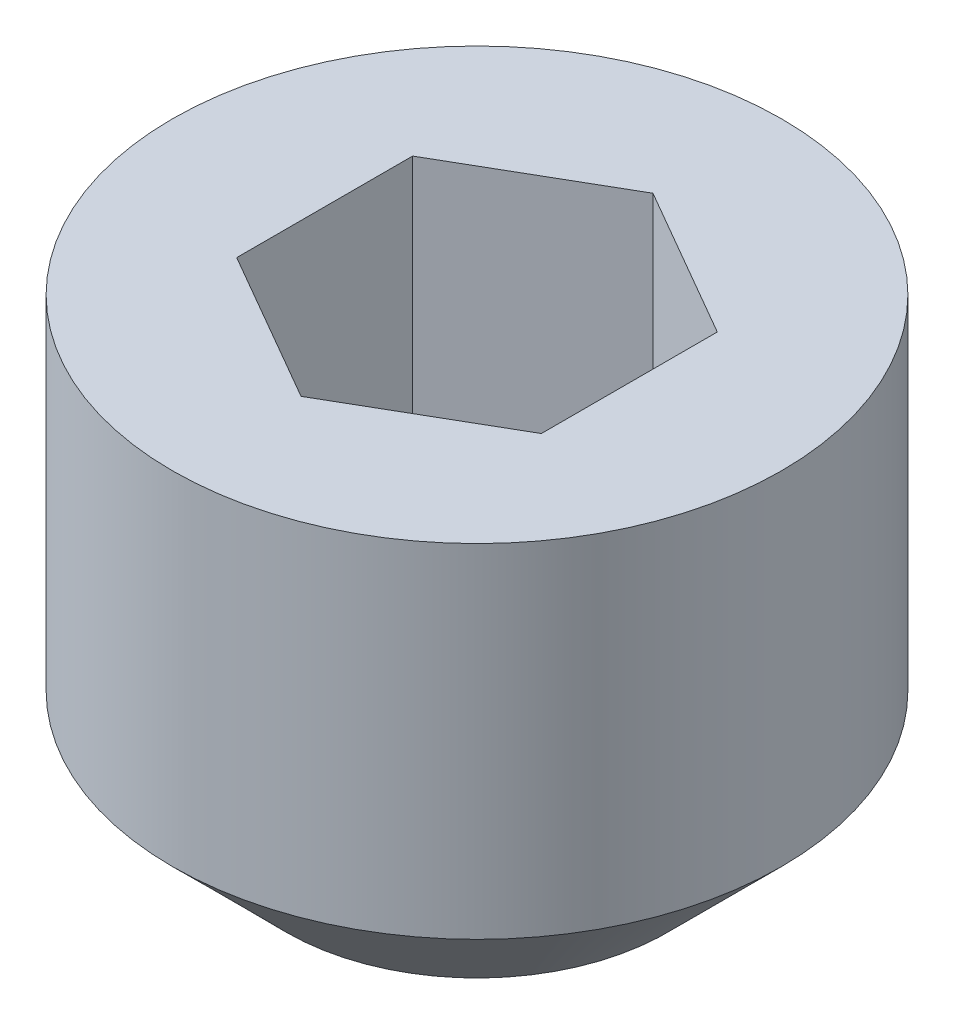
ISO-10303-21;
HEADER;
FILE_DESCRIPTION(('STEP AP214'),'2;1');
FILE_NAME('part.step','',(''),(''),'','','');
FILE_SCHEMA(('AUTOMOTIVE_DESIGN { 1 0 10303 214 1 1 1 1 }'));
ENDSEC;
DATA;
#1=APPLICATION_CONTEXT('core data for automotive mechanical design processes');
#2=APPLICATION_PROTOCOL_DEFINITION('international standard','automotive_design',2000,#1);
#3=PRODUCT_CONTEXT('',#1,'mechanical');
#4=PRODUCT('Part','Part','',(#3));
#5=PRODUCT_RELATED_PRODUCT_CATEGORY('part','',(#4));
#6=PRODUCT_DEFINITION_FORMATION('','',#4);
#7=PRODUCT_DEFINITION_CONTEXT('part definition',#1,'design');
#8=PRODUCT_DEFINITION('design','',#6,#7);
#9=PRODUCT_DEFINITION_SHAPE('','',#8);
#10=(LENGTH_UNIT() NAMED_UNIT(*) SI_UNIT(.MILLI.,.METRE.));
#11=(NAMED_UNIT(*) PLANE_ANGLE_UNIT() SI_UNIT($,.RADIAN.));
#12=(NAMED_UNIT(*) SI_UNIT($,.STERADIAN.) SOLID_ANGLE_UNIT());
#13=UNCERTAINTY_MEASURE_WITH_UNIT(LENGTH_MEASURE(1.E-05),#10,'distance_accuracy_value','');
#14=(GEOMETRIC_REPRESENTATION_CONTEXT(3) GLOBAL_UNCERTAINTY_ASSIGNED_CONTEXT((#13)) GLOBAL_UNIT_ASSIGNED_CONTEXT((#10,
#11,#12)) REPRESENTATION_CONTEXT('',''));
#15=CARTESIAN_POINT('',(0.,0.,0.));
#16=DIRECTION('',(0.,0.,1.));
#17=DIRECTION('',(1.,0.,0.));
#18=AXIS2_PLACEMENT_3D('',#15,#16,#17);
#19=CARTESIAN_POINT('',(0.,3.,0.));
#20=DIRECTION('',(0.,-1.,0.));
#21=DIRECTION('',(1.,0.,0.));
#22=AXIS2_PLACEMENT_3D('',#19,#20,#21);
#23=PLANE('',#22);
#24=CARTESIAN_POINT('',(0.,3.,0.));
#25=DIRECTION('',(0.,1.,0.));
#26=DIRECTION('',(-1.,0.,0.));
#27=AXIS2_PLACEMENT_3D('',#24,#25,#26);
#28=CIRCLE('',#27,2.);
#29=CARTESIAN_POINT('',(-2.,3.,0.));
#30=VERTEX_POINT('',#29);
#31=EDGE_CURVE('E11',#30,#30,#28,.T.);
#32=ORIENTED_EDGE('',*,*,#31,.T.);
#33=EDGE_LOOP('',(#32));
#34=FACE_BOUND('',#33,.T.);
#35=DIRECTION('',(-0.866025403784438,0.,0.5));
#36=VECTOR('',#35,1.);
#37=CARTESIAN_POINT('',(0.,3.,-1.15470053837925));
#38=LINE('',#37,#36);
#39=CARTESIAN_POINT('',(0.,3.,-1.15470053837925));
#40=VERTEX_POINT('',#39);
#41=CARTESIAN_POINT('',(-0.999999999999999,3.,-0.577350269189626));
#42=VERTEX_POINT('',#41);
#43=EDGE_CURVE('E149',#40,#42,#38,.T.);
#44=ORIENTED_EDGE('',*,*,#43,.F.);
#45=DIRECTION('',(-0.866025403784439,0.,-0.499999999999999));
#46=VECTOR('',#45,1.);
#47=CARTESIAN_POINT('',(1.,3.,-0.577350269189626));
#48=LINE('',#47,#46);
#49=CARTESIAN_POINT('',(1.,3.,-0.577350269189626));
#50=VERTEX_POINT('',#49);
#51=EDGE_CURVE('E49',#50,#40,#48,.T.);
#52=ORIENTED_EDGE('',*,*,#51,.F.);
#53=DIRECTION('',(0.,0.,-1.));
#54=VECTOR('',#53,1.);
#55=CARTESIAN_POINT('',(1.,3.,0.577350269189626));
#56=LINE('',#55,#54);
#57=CARTESIAN_POINT('',(1.,3.,0.577350269189626));
#58=VERTEX_POINT('',#57);
#59=EDGE_CURVE('E119',#58,#50,#56,.T.);
#60=ORIENTED_EDGE('',*,*,#59,.F.);
#61=DIRECTION('',(0.866025403784439,0.,-0.5));
#62=VECTOR('',#61,1.);
#63=CARTESIAN_POINT('',(0.,3.,1.15470053837925));
#64=LINE('',#63,#62);
#65=CARTESIAN_POINT('',(0.,3.,1.15470053837925));
#66=VERTEX_POINT('',#65);
#67=EDGE_CURVE('E157',#66,#58,#64,.T.);
#68=ORIENTED_EDGE('',*,*,#67,.F.);
#69=DIRECTION('',(0.866025403784439,0.,0.499999999999999));
#70=VECTOR('',#69,1.);
#71=CARTESIAN_POINT('',(-0.999999999999999,3.,0.577350269189626));
#72=LINE('',#71,#70);
#73=CARTESIAN_POINT('',(-0.999999999999999,3.,0.577350269189626));
#74=VERTEX_POINT('',#73);
#75=EDGE_CURVE('E154',#74,#66,#72,.T.);
#76=ORIENTED_EDGE('',*,*,#75,.F.);
#77=DIRECTION('',(0.,0.,1.));
#78=VECTOR('',#77,1.);
#79=CARTESIAN_POINT('',(-0.999999999999999,3.,-0.577350269189626));
#80=LINE('',#79,#78);
#81=EDGE_CURVE('E152',#42,#74,#80,.T.);
#82=ORIENTED_EDGE('',*,*,#81,.F.);
#83=EDGE_LOOP('',(#44,#52,#60,#68,#76,#82));
#84=FACE_BOUND('',#83,.T.);
#85=ADVANCED_FACE('F35',(#34,#84),#23,.F.);
#86=CARTESIAN_POINT('',(0.,3.,0.));
#87=DIRECTION('',(0.,1.,0.));
#88=DIRECTION('',(-1.,0.,0.));
#89=AXIS2_PLACEMENT_3D('',#86,#87,#88);
#90=CYLINDRICAL_SURFACE('',#89,2.);
#91=CARTESIAN_POINT('',(0.,0.749999999999992,0.));
#92=DIRECTION('',(0.,-1.,0.));
#93=DIRECTION('',(0.,0.,-1.));
#94=AXIS2_PLACEMENT_3D('',#91,#92,#93);
#95=CIRCLE('',#94,2.);
#96=CARTESIAN_POINT('',(0.,0.749999999999992,-2.));
#97=VERTEX_POINT('',#96);
#98=EDGE_CURVE('E358',#97,#97,#95,.T.);
#99=ORIENTED_EDGE('',*,*,#98,.F.);
#100=EDGE_LOOP('',(#99));
#101=FACE_BOUND('',#100,.T.);
#102=ORIENTED_EDGE('',*,*,#31,.F.);
#103=EDGE_LOOP('',(#102));
#104=FACE_BOUND('',#103,.T.);
#105=ADVANCED_FACE('F218',(#101,#104),#90,.T.);
#106=CARTESIAN_POINT('',(1.,1.5,-0.577350269189626));
#107=DIRECTION('',(0.499999999999999,0.,-0.866025403784439));
#108=DIRECTION('',(-0.866025403784439,0.,-0.499999999999999));
#109=AXIS2_PLACEMENT_3D('',#106,#107,#108);
#110=PLANE('',#109);
#111=DIRECTION('',(-0.866025403784439,0.,-0.499999999999999));
#112=VECTOR('',#111,1.);
#113=CARTESIAN_POINT('',(1.,1.5,-0.577350269189626));
#114=LINE('',#113,#112);
#115=CARTESIAN_POINT('',(1.,1.5,-0.577350269189626));
#116=VERTEX_POINT('',#115);
#117=CARTESIAN_POINT('',(0.5,1.5,-0.86602540378444));
#118=VERTEX_POINT('',#117);
#119=EDGE_CURVE('E118',#116,#118,#114,.T.);
#120=ORIENTED_EDGE('',*,*,#119,.F.);
#121=DIRECTION('',(0.,1.,0.));
#122=VECTOR('',#121,1.);
#123=CARTESIAN_POINT('',(1.,1.5,-0.577350269189626));
#124=LINE('',#123,#122);
#125=EDGE_CURVE('E160',#116,#50,#124,.T.);
#126=ORIENTED_EDGE('',*,*,#125,.T.);
#127=ORIENTED_EDGE('',*,*,#51,.T.);
#128=DIRECTION('',(0.,1.,0.));
#129=VECTOR('',#128,1.);
#130=CARTESIAN_POINT('',(0.,1.5,-1.15470053837925));
#131=LINE('',#130,#129);
#132=CARTESIAN_POINT('',(0.,1.5,-1.15470053837925));
#133=VERTEX_POINT('',#132);
#134=EDGE_CURVE('E121',#133,#40,#131,.T.);
#135=ORIENTED_EDGE('',*,*,#134,.F.);
#136=EDGE_CURVE('E110',#118,#133,#114,.T.);
#137=ORIENTED_EDGE('',*,*,#136,.F.);
#138=EDGE_LOOP('',(#120,#126,#127,#135,#137));
#139=FACE_BOUND('',#138,.T.);
#140=ADVANCED_FACE('F122',(#139),#110,.F.);
#141=CARTESIAN_POINT('',(1.,1.5,0.577350269189626));
#142=DIRECTION('',(1.,0.,0.));
#143=DIRECTION('',(0.,0.,-1.));
#144=AXIS2_PLACEMENT_3D('',#141,#142,#143);
#145=PLANE('',#144);
#146=DIRECTION('',(0.,0.,-1.));
#147=VECTOR('',#146,1.);
#148=CARTESIAN_POINT('',(1.,1.5,0.577350269189626));
#149=LINE('',#148,#147);
#150=CARTESIAN_POINT('',(1.,1.5,0.577350269189626));
#151=VERTEX_POINT('',#150);
#152=CARTESIAN_POINT('',(1.,1.5,0.));
#153=VERTEX_POINT('',#152);
#154=EDGE_CURVE('E126',#151,#153,#149,.T.);
#155=ORIENTED_EDGE('',*,*,#154,.F.);
#156=DIRECTION('',(0.,1.,0.));
#157=VECTOR('',#156,1.);
#158=CARTESIAN_POINT('',(1.,1.5,0.577350269189626));
#159=LINE('',#158,#157);
#160=EDGE_CURVE('E163',#151,#58,#159,.T.);
#161=ORIENTED_EDGE('',*,*,#160,.T.);
#162=ORIENTED_EDGE('',*,*,#59,.T.);
#163=ORIENTED_EDGE('',*,*,#125,.F.);
#164=EDGE_CURVE('E145',#153,#116,#149,.T.);
#165=ORIENTED_EDGE('',*,*,#164,.F.);
#166=EDGE_LOOP('',(#155,#161,#162,#163,#165));
#167=FACE_BOUND('',#166,.T.);
#168=ADVANCED_FACE('F191',(#167),#145,.F.);
#169=CARTESIAN_POINT('',(0.,1.5,1.15470053837925));
#170=DIRECTION('',(0.5,0.,0.866025403784438));
#171=DIRECTION('',(0.866025403784439,0.,-0.5));
#172=AXIS2_PLACEMENT_3D('',#169,#170,#171);
#173=PLANE('',#172);
#174=DIRECTION('',(0.866025403784439,0.,-0.5));
#175=VECTOR('',#174,1.);
#176=CARTESIAN_POINT('',(0.,1.5,1.15470053837925));
#177=LINE('',#176,#175);
#178=CARTESIAN_POINT('',(0.,1.5,1.15470053837925));
#179=VERTEX_POINT('',#178);
#180=CARTESIAN_POINT('',(0.500000000000001,1.5,0.866025403784439));
#181=VERTEX_POINT('',#180);
#182=EDGE_CURVE('E57',#179,#181,#177,.T.);
#183=ORIENTED_EDGE('',*,*,#182,.F.);
#184=DIRECTION('',(0.,1.,0.));
#185=VECTOR('',#184,1.);
#186=CARTESIAN_POINT('',(0.,1.5,1.15470053837925));
#187=LINE('',#186,#185);
#188=EDGE_CURVE('E166',#179,#66,#187,.T.);
#189=ORIENTED_EDGE('',*,*,#188,.T.);
#190=ORIENTED_EDGE('',*,*,#67,.T.);
#191=ORIENTED_EDGE('',*,*,#160,.F.);
#192=EDGE_CURVE('E143',#181,#151,#177,.T.);
#193=ORIENTED_EDGE('',*,*,#192,.F.);
#194=EDGE_LOOP('',(#183,#189,#190,#191,#193));
#195=FACE_BOUND('',#194,.T.);
#196=ADVANCED_FACE('F246',(#195),#173,.F.);
#197=CARTESIAN_POINT('',(-1.,1.5,0.577350269189626));
#198=DIRECTION('',(-0.5,0.,0.866025403784439));
#199=DIRECTION('',(0.866025403784439,0.,0.5));
#200=AXIS2_PLACEMENT_3D('',#197,#198,#199);
#201=PLANE('',#200);
#202=DIRECTION('',(0.866025403784439,0.,0.499999999999999));
#203=VECTOR('',#202,1.);
#204=CARTESIAN_POINT('',(-1.,1.5,0.577350269189626));
#205=LINE('',#204,#203);
#206=CARTESIAN_POINT('',(-1.,1.5,0.577350269189626));
#207=VERTEX_POINT('',#206);
#208=CARTESIAN_POINT('',(-0.499999999999999,1.5,0.866025403784439));
#209=VERTEX_POINT('',#208);
#210=EDGE_CURVE('E140',#207,#209,#205,.T.);
#211=ORIENTED_EDGE('',*,*,#210,.F.);
#212=DIRECTION('',(0.,1.,0.));
#213=VECTOR('',#212,1.);
#214=CARTESIAN_POINT('',(-1.,1.5,0.577350269189626));
#215=LINE('',#214,#213);
#216=EDGE_CURVE('E169',#207,#74,#215,.T.);
#217=ORIENTED_EDGE('',*,*,#216,.T.);
#218=ORIENTED_EDGE('',*,*,#75,.T.);
#219=ORIENTED_EDGE('',*,*,#188,.F.);
#220=EDGE_CURVE('E139',#209,#179,#205,.T.);
#221=ORIENTED_EDGE('',*,*,#220,.F.);
#222=EDGE_LOOP('',(#211,#217,#218,#219,#221));
#223=FACE_BOUND('',#222,.T.);
#224=ADVANCED_FACE('F243',(#223),#201,.F.);
#225=CARTESIAN_POINT('',(-1.,1.5,-0.577350269189626));
#226=DIRECTION('',(-1.,0.,0.));
#227=DIRECTION('',(0.,-1.,0.));
#228=AXIS2_PLACEMENT_3D('',#225,#226,#227);
#229=PLANE('',#228);
#230=DIRECTION('',(0.,0.,1.));
#231=VECTOR('',#230,1.);
#232=CARTESIAN_POINT('',(-1.,1.5,-0.577350269189626));
#233=LINE('',#232,#231);
#234=CARTESIAN_POINT('',(-1.,1.5,-0.577350269189626));
#235=VERTEX_POINT('',#234);
#236=CARTESIAN_POINT('',(-1.,1.5,0.));
#237=VERTEX_POINT('',#236);
#238=EDGE_CURVE('E134',#235,#237,#233,.T.);
#239=ORIENTED_EDGE('',*,*,#238,.F.);
#240=DIRECTION('',(0.,1.,0.));
#241=VECTOR('',#240,1.);
#242=CARTESIAN_POINT('',(-1.,1.5,-0.577350269189626));
#243=LINE('',#242,#241);
#244=EDGE_CURVE('E125',#235,#42,#243,.T.);
#245=ORIENTED_EDGE('',*,*,#244,.T.);
#246=ORIENTED_EDGE('',*,*,#81,.T.);
#247=ORIENTED_EDGE('',*,*,#216,.F.);
#248=EDGE_CURVE('E132',#237,#207,#233,.T.);
#249=ORIENTED_EDGE('',*,*,#248,.F.);
#250=EDGE_LOOP('',(#239,#245,#246,#247,#249));
#251=FACE_BOUND('',#250,.T.);
#252=ADVANCED_FACE('F201',(#251),#229,.F.);
#253=CARTESIAN_POINT('',(0.,1.5,-1.15470053837925));
#254=DIRECTION('',(-0.500000000000001,0.,-0.866025403784438));
#255=DIRECTION('',(-0.866025403784438,0.,0.500000000000001));
#256=AXIS2_PLACEMENT_3D('',#253,#254,#255);
#257=PLANE('',#256);
#258=DIRECTION('',(-0.866025403784438,0.,0.5));
#259=VECTOR('',#258,1.);
#260=CARTESIAN_POINT('',(0.,1.5,-1.15470053837925));
#261=LINE('',#260,#259);
#262=CARTESIAN_POINT('',(-0.5,1.5,-0.866025403784438));
#263=VERTEX_POINT('',#262);
#264=EDGE_CURVE('E113',#133,#263,#261,.T.);
#265=ORIENTED_EDGE('',*,*,#264,.F.);
#266=ORIENTED_EDGE('',*,*,#134,.T.);
#267=ORIENTED_EDGE('',*,*,#43,.T.);
#268=ORIENTED_EDGE('',*,*,#244,.F.);
#269=EDGE_CURVE('E131',#263,#235,#261,.T.);
#270=ORIENTED_EDGE('',*,*,#269,.F.);
#271=EDGE_LOOP('',(#265,#266,#267,#268,#270));
#272=FACE_BOUND('',#271,.T.);
#273=ADVANCED_FACE('F129',(#272),#257,.F.);
#274=CARTESIAN_POINT('',(0.,1.5,0.));
#275=DIRECTION('',(0.,1.,0.));
#276=DIRECTION('',(0.,0.,1.));
#277=AXIS2_PLACEMENT_3D('',#274,#275,#276);
#278=PLANE('',#277);
#279=ORIENTED_EDGE('',*,*,#192,.T.);
#280=ORIENTED_EDGE('',*,*,#154,.T.);
#281=CARTESIAN_POINT('',(0.,1.5,0.));
#282=DIRECTION('',(0.,1.,0.));
#283=DIRECTION('',(-1.,0.,0.));
#284=AXIS2_PLACEMENT_3D('',#281,#282,#283);
#285=CIRCLE('',#284,1.);
#286=EDGE_CURVE('E178',#181,#153,#285,.T.);
#287=ORIENTED_EDGE('',*,*,#286,.F.);
#288=EDGE_LOOP('',(#279,#280,#287));
#289=FACE_BOUND('',#288,.T.);
#290=ADVANCED_FACE('F186',(#289),#278,.T.);
#291=ORIENTED_EDGE('',*,*,#164,.T.);
#292=ORIENTED_EDGE('',*,*,#119,.T.);
#293=EDGE_CURVE('E179',#153,#118,#285,.T.);
#294=ORIENTED_EDGE('',*,*,#293,.F.);
#295=EDGE_LOOP('',(#291,#292,#294));
#296=FACE_BOUND('',#295,.T.);
#297=ADVANCED_FACE('F195',(#296),#278,.T.);
#298=ORIENTED_EDGE('',*,*,#136,.T.);
#299=ORIENTED_EDGE('',*,*,#264,.T.);
#300=EDGE_CURVE('E115',#118,#263,#285,.T.);
#301=ORIENTED_EDGE('',*,*,#300,.F.);
#302=EDGE_LOOP('',(#298,#299,#301));
#303=FACE_BOUND('',#302,.T.);
#304=ADVANCED_FACE('F111',(#303),#278,.T.);
#305=ORIENTED_EDGE('',*,*,#269,.T.);
#306=ORIENTED_EDGE('',*,*,#238,.T.);
#307=EDGE_CURVE('E162',#263,#237,#285,.T.);
#308=ORIENTED_EDGE('',*,*,#307,.F.);
#309=EDGE_LOOP('',(#305,#306,#308));
#310=FACE_BOUND('',#309,.T.);
#311=ADVANCED_FACE('F205',(#310),#278,.T.);
#312=ORIENTED_EDGE('',*,*,#248,.T.);
#313=ORIENTED_EDGE('',*,*,#210,.T.);
#314=EDGE_CURVE('E42',#237,#209,#285,.T.);
#315=ORIENTED_EDGE('',*,*,#314,.F.);
#316=EDGE_LOOP('',(#312,#313,#315));
#317=FACE_BOUND('',#316,.T.);
#318=ADVANCED_FACE('F207',(#317),#278,.T.);
#319=ORIENTED_EDGE('',*,*,#220,.T.);
#320=ORIENTED_EDGE('',*,*,#182,.T.);
#321=EDGE_CURVE('E174',#209,#181,#285,.T.);
#322=ORIENTED_EDGE('',*,*,#321,.F.);
#323=EDGE_LOOP('',(#319,#320,#322));
#324=FACE_BOUND('',#323,.T.);
#325=ADVANCED_FACE('F213',(#324),#278,.T.);
#326=CARTESIAN_POINT('',(0.,0.922649730810377,0.));
#327=DIRECTION('',(0.,1.,0.));
#328=DIRECTION('',(-1.,0.,0.));
#329=AXIS2_PLACEMENT_3D('',#326,#327,#328);
#330=CONICAL_SURFACE('',#329,0.,1.0471975511966);
#331=ORIENTED_EDGE('',*,*,#314,.T.);
#332=ORIENTED_EDGE('',*,*,#321,.T.);
#333=ORIENTED_EDGE('',*,*,#286,.T.);
#334=ORIENTED_EDGE('',*,*,#293,.T.);
#335=ORIENTED_EDGE('',*,*,#300,.T.);
#336=ORIENTED_EDGE('',*,*,#307,.T.);
#337=EDGE_LOOP('',(#331,#332,#333,#334,#335,#336));
#338=FACE_BOUND('',#337,.T.);
#339=CARTESIAN_POINT('',(0.,0.922649730810377,0.));
#340=VERTEX_POINT('',#339);
#341=VERTEX_LOOP('',#340);
#342=FACE_BOUND('',#341,.T.);
#343=ADVANCED_FACE('F183',(#338,#342),#330,.F.);
#344=CARTESIAN_POINT('',(0.,0.749999999999992,0.));
#345=DIRECTION('',(0.,1.,0.));
#346=DIRECTION('',(0.,0.,1.));
#347=AXIS2_PLACEMENT_3D('',#344,#345,#346);
#348=CONICAL_SURFACE('',#347,2.,0.785398163397453);
#349=CARTESIAN_POINT('',(0.,0.,0.));
#350=DIRECTION('',(0.,-1.,0.));
#351=DIRECTION('',(0.,0.,-1.));
#352=AXIS2_PLACEMENT_3D('',#349,#350,#351);
#353=CIRCLE('',#352,1.25);
#354=CARTESIAN_POINT('',(0.,0.,-1.25));
#355=VERTEX_POINT('',#354);
#356=EDGE_CURVE('E150',#355,#355,#353,.T.);
#357=ORIENTED_EDGE('',*,*,#356,.F.);
#358=EDGE_LOOP('',(#357));
#359=FACE_BOUND('',#358,.T.);
#360=ORIENTED_EDGE('',*,*,#98,.T.);
#361=EDGE_LOOP('',(#360));
#362=FACE_BOUND('',#361,.T.);
#363=ADVANCED_FACE('F235',(#359,#362),#348,.T.);
#364=CARTESIAN_POINT('',(2.,0.,0.));
#365=DIRECTION('',(0.,1.,0.));
#366=DIRECTION('',(-1.,0.,0.));
#367=AXIS2_PLACEMENT_3D('',#364,#365,#366);
#368=PLANE('',#367);
#369=ORIENTED_EDGE('',*,*,#356,.T.);
#370=EDGE_LOOP('',(#369));
#371=FACE_BOUND('',#370,.T.);
#372=ADVANCED_FACE('F232',(#371),#368,.F.);
#373=CLOSED_SHELL('',(#85,#105,#140,#168,#196,#224,#252,#273,#290,#297,#304,#311,#318,#325,#343,
#363,#372));
#374=MANIFOLD_SOLID_BREP('B2',#373);
#375=ADVANCED_BREP_SHAPE_REPRESENTATION('',(#18,#374),#14);
#376=SHAPE_DEFINITION_REPRESENTATION(#9,#375);
ENDSEC;
END-ISO-10303-21;
